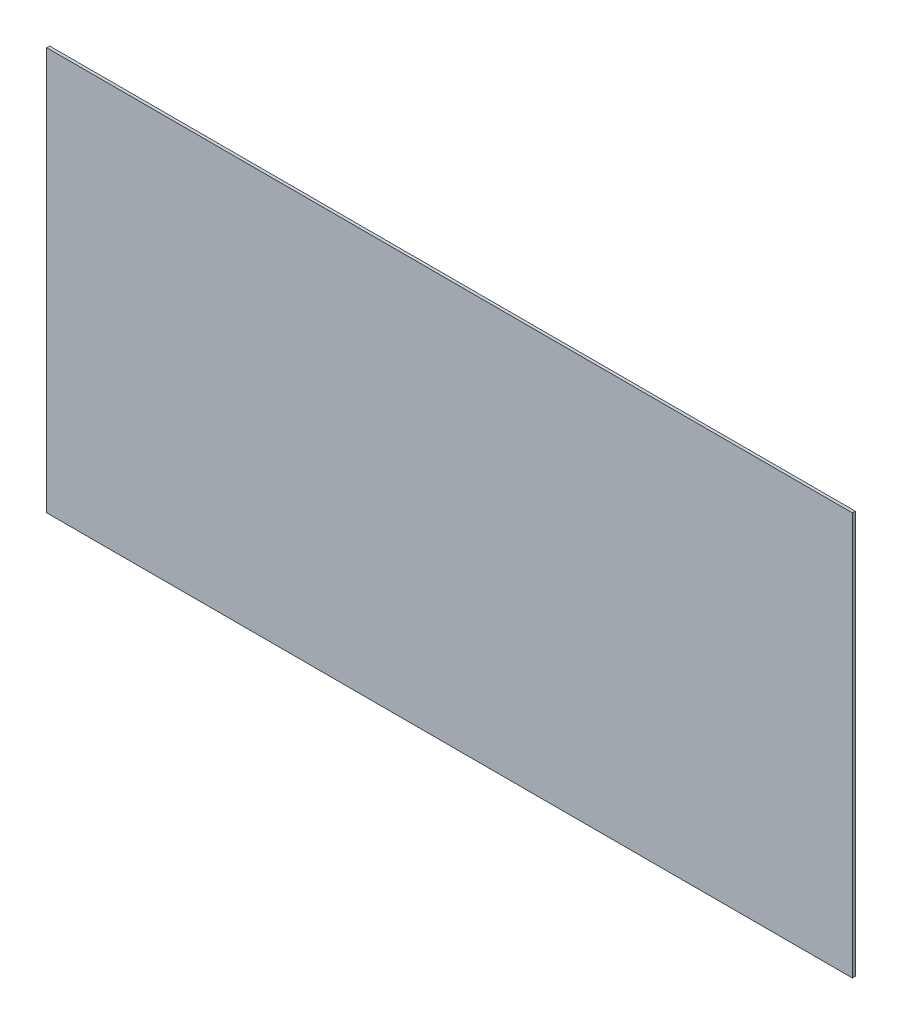
ISO-10303-21;
HEADER;
FILE_DESCRIPTION(('STEP AP214'),'2;1');
FILE_NAME('part.step','',(''),(''),'','','');
FILE_SCHEMA(('AUTOMOTIVE_DESIGN { 1 0 10303 214 1 1 1 1 }'));
ENDSEC;
DATA;
#1=APPLICATION_CONTEXT('core data for automotive mechanical design processes');
#2=APPLICATION_PROTOCOL_DEFINITION('international standard','automotive_design',2000,#1);
#3=PRODUCT_CONTEXT('',#1,'mechanical');
#4=PRODUCT('Part','Part','',(#3));
#5=PRODUCT_RELATED_PRODUCT_CATEGORY('part','',(#4));
#6=PRODUCT_DEFINITION_FORMATION('','',#4);
#7=PRODUCT_DEFINITION_CONTEXT('part definition',#1,'design');
#8=PRODUCT_DEFINITION('design','',#6,#7);
#9=PRODUCT_DEFINITION_SHAPE('','',#8);
#10=(LENGTH_UNIT() NAMED_UNIT(*) SI_UNIT(.MILLI.,.METRE.));
#11=(NAMED_UNIT(*) PLANE_ANGLE_UNIT() SI_UNIT($,.RADIAN.));
#12=(NAMED_UNIT(*) SI_UNIT($,.STERADIAN.) SOLID_ANGLE_UNIT());
#13=UNCERTAINTY_MEASURE_WITH_UNIT(LENGTH_MEASURE(1.E-05),#10,'distance_accuracy_value','');
#14=(GEOMETRIC_REPRESENTATION_CONTEXT(3) GLOBAL_UNCERTAINTY_ASSIGNED_CONTEXT((#13)) GLOBAL_UNIT_ASSIGNED_CONTEXT((#10,
#11,#12)) REPRESENTATION_CONTEXT('',''));
#15=CARTESIAN_POINT('',(0.,0.,0.));
#16=DIRECTION('',(0.,0.,1.));
#17=DIRECTION('',(1.,0.,0.));
#18=AXIS2_PLACEMENT_3D('',#15,#16,#17);
#19=CARTESIAN_POINT('',(46.4211028126488,1225.49276974416,9.));
#20=DIRECTION('',(-1.,0.,0.));
#21=DIRECTION('',(0.,-1.,0.));
#22=AXIS2_PLACEMENT_3D('',#19,#20,#21);
#23=PLANE('',#22);
#24=DIRECTION('',(0.,1.,0.));
#25=VECTOR('',#24,1.);
#26=CARTESIAN_POINT('',(46.4211028126488,1225.49276974416,0.));
#27=LINE('',#26,#25);
#28=CARTESIAN_POINT('',(46.421102812649,-24.5072302558398,0.));
#29=VERTEX_POINT('',#28);
#30=CARTESIAN_POINT('',(46.4211028126488,1225.49276974416,0.));
#31=VERTEX_POINT('',#30);
#32=EDGE_CURVE('E102',#29,#31,#27,.T.);
#33=ORIENTED_EDGE('',*,*,#32,.T.);
#34=DIRECTION('',(0.,0.,-1.));
#35=VECTOR('',#34,1.);
#36=CARTESIAN_POINT('',(46.4211028126488,1225.49276974416,9.));
#37=LINE('',#36,#35);
#38=CARTESIAN_POINT('',(46.4211028126488,1225.49276974416,9.));
#39=VERTEX_POINT('',#38);
#40=EDGE_CURVE('E11',#39,#31,#37,.T.);
#41=ORIENTED_EDGE('',*,*,#40,.F.);
#42=DIRECTION('',(0.,1.,0.));
#43=VECTOR('',#42,1.);
#44=CARTESIAN_POINT('',(46.4211028126488,1225.49276974416,9.));
#45=LINE('',#44,#43);
#46=CARTESIAN_POINT('',(46.421102812649,-24.5072302558398,9.));
#47=VERTEX_POINT('',#46);
#48=EDGE_CURVE('E90',#47,#39,#45,.T.);
#49=ORIENTED_EDGE('',*,*,#48,.F.);
#50=DIRECTION('',(0.,0.,-1.));
#51=VECTOR('',#50,1.);
#52=CARTESIAN_POINT('',(46.421102812649,-24.5072302558398,9.));
#53=LINE('',#52,#51);
#54=EDGE_CURVE('E98',#47,#29,#53,.T.);
#55=ORIENTED_EDGE('',*,*,#54,.T.);
#56=EDGE_LOOP('',(#33,#41,#49,#55));
#57=FACE_BOUND('',#56,.T.);
#58=ADVANCED_FACE('F39',(#57),#23,.F.);
#59=CARTESIAN_POINT('',(-2453.57889718735,1225.49276974416,9.));
#60=DIRECTION('',(0.,-1.,0.));
#61=DIRECTION('',(0.,0.,-1.));
#62=AXIS2_PLACEMENT_3D('',#59,#60,#61);
#63=PLANE('',#62);
#64=DIRECTION('',(-1.,0.,0.));
#65=VECTOR('',#64,1.);
#66=CARTESIAN_POINT('',(-2453.57889718735,1225.49276974416,0.));
#67=LINE('',#66,#65);
#68=CARTESIAN_POINT('',(-2453.57889718735,1225.49276974416,0.));
#69=VERTEX_POINT('',#68);
#70=EDGE_CURVE('E94',#31,#69,#67,.T.);
#71=ORIENTED_EDGE('',*,*,#70,.T.);
#72=DIRECTION('',(0.,0.,-1.));
#73=VECTOR('',#72,1.);
#74=CARTESIAN_POINT('',(-2453.57889718735,1225.49276974416,9.));
#75=LINE('',#74,#73);
#76=CARTESIAN_POINT('',(-2453.57889718735,1225.49276974416,9.));
#77=VERTEX_POINT('',#76);
#78=EDGE_CURVE('E47',#77,#69,#75,.T.);
#79=ORIENTED_EDGE('',*,*,#78,.F.);
#80=DIRECTION('',(-1.,0.,0.));
#81=VECTOR('',#80,1.);
#82=CARTESIAN_POINT('',(-2453.57889718735,1225.49276974416,9.));
#83=LINE('',#82,#81);
#84=EDGE_CURVE('E85',#39,#77,#83,.T.);
#85=ORIENTED_EDGE('',*,*,#84,.F.);
#86=ORIENTED_EDGE('',*,*,#40,.T.);
#87=EDGE_LOOP('',(#71,#79,#85,#86));
#88=FACE_BOUND('',#87,.T.);
#89=ADVANCED_FACE('F93',(#88),#63,.F.);
#90=CARTESIAN_POINT('',(-2453.57889718735,1225.49276974416,9.));
#91=DIRECTION('',(1.,0.,0.));
#92=DIRECTION('',(0.,0.,-1.));
#93=AXIS2_PLACEMENT_3D('',#90,#91,#92);
#94=PLANE('',#93);
#95=DIRECTION('',(0.,-1.,0.));
#96=VECTOR('',#95,1.);
#97=CARTESIAN_POINT('',(-2453.57889718735,1225.49276974416,0.));
#98=LINE('',#97,#96);
#99=CARTESIAN_POINT('',(-2453.57889718735,-24.5072302558398,0.));
#100=VERTEX_POINT('',#99);
#101=EDGE_CURVE('E72',#69,#100,#98,.T.);
#102=ORIENTED_EDGE('',*,*,#101,.T.);
#103=DIRECTION('',(0.,0.,-1.));
#104=VECTOR('',#103,1.);
#105=CARTESIAN_POINT('',(-2453.57889718735,-24.5072302558398,9.));
#106=LINE('',#105,#104);
#107=CARTESIAN_POINT('',(-2453.57889718735,-24.5072302558398,9.));
#108=VERTEX_POINT('',#107);
#109=EDGE_CURVE('E95',#108,#100,#106,.T.);
#110=ORIENTED_EDGE('',*,*,#109,.F.);
#111=DIRECTION('',(0.,-1.,0.));
#112=VECTOR('',#111,1.);
#113=CARTESIAN_POINT('',(-2453.57889718735,1225.49276974416,9.));
#114=LINE('',#113,#112);
#115=EDGE_CURVE('E88',#77,#108,#114,.T.);
#116=ORIENTED_EDGE('',*,*,#115,.F.);
#117=ORIENTED_EDGE('',*,*,#78,.T.);
#118=EDGE_LOOP('',(#102,#110,#116,#117));
#119=FACE_BOUND('',#118,.T.);
#120=ADVANCED_FACE('F96',(#119),#94,.F.);
#121=CARTESIAN_POINT('',(-2453.57889718735,-24.5072302558398,9.));
#122=DIRECTION('',(0.,1.,0.));
#123=DIRECTION('',(0.,0.,1.));
#124=AXIS2_PLACEMENT_3D('',#121,#122,#123);
#125=PLANE('',#124);
#126=DIRECTION('',(1.,0.,0.));
#127=VECTOR('',#126,1.);
#128=CARTESIAN_POINT('',(-2453.57889718735,-24.5072302558398,0.));
#129=LINE('',#128,#127);
#130=EDGE_CURVE('E78',#100,#29,#129,.T.);
#131=ORIENTED_EDGE('',*,*,#130,.T.);
#132=ORIENTED_EDGE('',*,*,#54,.F.);
#133=DIRECTION('',(1.,0.,0.));
#134=VECTOR('',#133,1.);
#135=CARTESIAN_POINT('',(-2453.57889718735,-24.5072302558398,9.));
#136=LINE('',#135,#134);
#137=EDGE_CURVE('E55',#108,#47,#136,.T.);
#138=ORIENTED_EDGE('',*,*,#137,.F.);
#139=ORIENTED_EDGE('',*,*,#109,.T.);
#140=EDGE_LOOP('',(#131,#132,#138,#139));
#141=FACE_BOUND('',#140,.T.);
#142=ADVANCED_FACE('F109',(#141),#125,.F.);
#143=CARTESIAN_POINT('',(0.,0.,9.));
#144=DIRECTION('',(0.,0.,1.));
#145=DIRECTION('',(1.,0.,0.));
#146=AXIS2_PLACEMENT_3D('',#143,#144,#145);
#147=PLANE('',#146);
#148=ORIENTED_EDGE('',*,*,#48,.T.);
#149=ORIENTED_EDGE('',*,*,#84,.T.);
#150=ORIENTED_EDGE('',*,*,#115,.T.);
#151=ORIENTED_EDGE('',*,*,#137,.T.);
#152=EDGE_LOOP('',(#148,#149,#150,#151));
#153=FACE_BOUND('',#152,.T.);
#154=ADVANCED_FACE('F86',(#153),#147,.T.);
#155=CARTESIAN_POINT('',(0.,0.,0.));
#156=DIRECTION('',(0.,0.,1.));
#157=DIRECTION('',(1.,0.,0.));
#158=AXIS2_PLACEMENT_3D('',#155,#156,#157);
#159=PLANE('',#158);
#160=ORIENTED_EDGE('',*,*,#32,.F.);
#161=ORIENTED_EDGE('',*,*,#130,.F.);
#162=ORIENTED_EDGE('',*,*,#101,.F.);
#163=ORIENTED_EDGE('',*,*,#70,.F.);
#164=EDGE_LOOP('',(#160,#161,#162,#163));
#165=FACE_BOUND('',#164,.T.);
#166=ADVANCED_FACE('F112',(#165),#159,.F.);
#167=CLOSED_SHELL('',(#58,#89,#120,#142,#154,#166));
#168=MANIFOLD_SOLID_BREP('B2',#167);
#169=ADVANCED_BREP_SHAPE_REPRESENTATION('',(#18,#168),#14);
#170=SHAPE_DEFINITION_REPRESENTATION(#9,#169);
ENDSEC;
END-ISO-10303-21;
